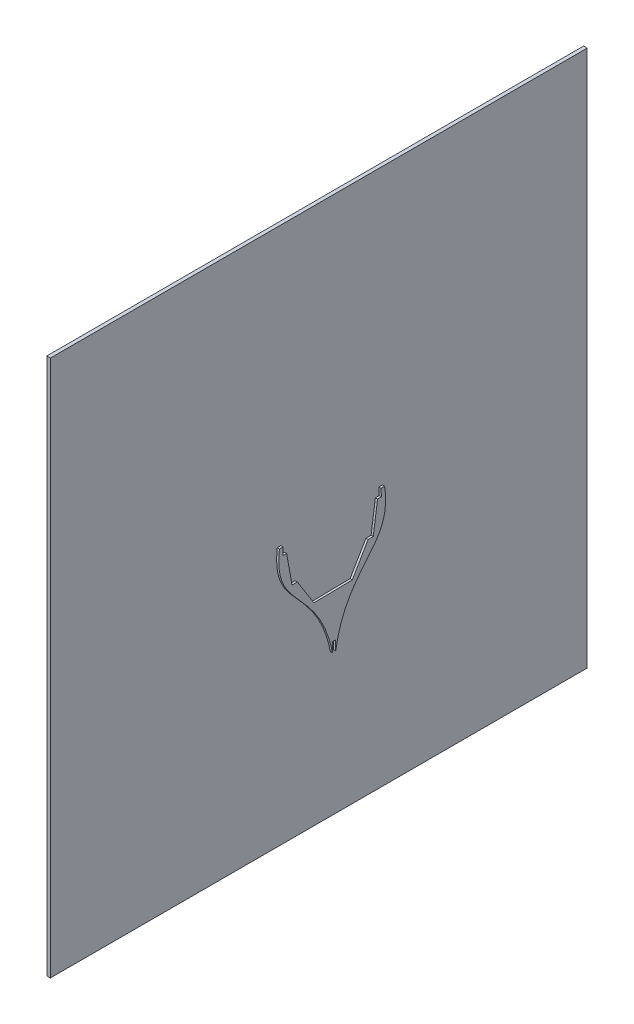
ISO-10303-21;
HEADER;
FILE_DESCRIPTION(('STEP AP214'),'2;1');
FILE_NAME('part.step','',(''),(''),'','','');
FILE_SCHEMA(('AUTOMOTIVE_DESIGN { 1 0 10303 214 1 1 1 1 }'));
ENDSEC;
DATA;
#1=APPLICATION_CONTEXT('core data for automotive mechanical design processes');
#2=APPLICATION_PROTOCOL_DEFINITION('international standard','automotive_design',2000,#1);
#3=PRODUCT_CONTEXT('',#1,'mechanical');
#4=PRODUCT('Part','Part','',(#3));
#5=PRODUCT_RELATED_PRODUCT_CATEGORY('part','',(#4));
#6=PRODUCT_DEFINITION_FORMATION('','',#4);
#7=PRODUCT_DEFINITION_CONTEXT('part definition',#1,'design');
#8=PRODUCT_DEFINITION('design','',#6,#7);
#9=PRODUCT_DEFINITION_SHAPE('','',#8);
#10=(LENGTH_UNIT() NAMED_UNIT(*) SI_UNIT(.MILLI.,.METRE.));
#11=(NAMED_UNIT(*) PLANE_ANGLE_UNIT() SI_UNIT($,.RADIAN.));
#12=(NAMED_UNIT(*) SI_UNIT($,.STERADIAN.) SOLID_ANGLE_UNIT());
#13=UNCERTAINTY_MEASURE_WITH_UNIT(LENGTH_MEASURE(1.E-05),#10,'distance_accuracy_value','');
#14=(GEOMETRIC_REPRESENTATION_CONTEXT(3) GLOBAL_UNCERTAINTY_ASSIGNED_CONTEXT((#13)) GLOBAL_UNIT_ASSIGNED_CONTEXT((#10,
#11,#12)) REPRESENTATION_CONTEXT('',''));
#15=CARTESIAN_POINT('',(0.,0.,0.));
#16=DIRECTION('',(0.,0.,1.));
#17=DIRECTION('',(1.,0.,0.));
#18=AXIS2_PLACEMENT_3D('',#15,#16,#17);
#19=CARTESIAN_POINT('',(6.,355.179062816754,153.44097527104));
#20=CARTESIAN_POINT('',(6.,174.645351927009,174.400842662759));
#21=CARTESIAN_POINT('',(6.,237.675764763136,17.1037062044611));
#22=CARTESIAN_POINT('',(6.,18.0649619587303,4.61229483232223));
#23=CARTESIAN_POINT('',(6.,0.,0.));
#24=B_SPLINE_CURVE_WITH_KNOTS('',4,(#19,#20,#21,#22,#23),.UNSPECIFIED.,.F.,.F.,(5,5),(0.,1.),.UNSPECIFIED.);
#25=DIRECTION('',(-1.,0.,0.));
#26=VECTOR('',#25,1.);
#27=SURFACE_OF_LINEAR_EXTRUSION('',#24,#26);
#28=CARTESIAN_POINT('',(0.,355.179062816754,153.44097527104));
#29=CARTESIAN_POINT('',(0.,174.645351927009,174.400842662759));
#30=CARTESIAN_POINT('',(0.,237.675764763136,17.1037062044611));
#31=CARTESIAN_POINT('',(0.,18.0649619587303,4.61229483232223));
#32=CARTESIAN_POINT('',(0.,0.,0.));
#33=B_SPLINE_CURVE_WITH_KNOTS('',4,(#28,#29,#30,#31,#32),.UNSPECIFIED.,.F.,.F.,(5,5),(0.,1.),.UNSPECIFIED.);
#34=CARTESIAN_POINT('',(0.,355.179062816754,153.44097527104));
#35=VERTEX_POINT('',#34);
#36=CARTESIAN_POINT('',(0.,29.9772074731045,5.04452517346933));
#37=VERTEX_POINT('',#36);
#38=EDGE_CURVE('E192',#35,#37,#33,.T.);
#39=ORIENTED_EDGE('',*,*,#38,.T.);
#40=DIRECTION('',(1.,0.,0.));
#41=VECTOR('',#40,1.);
#42=CARTESIAN_POINT('',(0.,29.9772074731045,5.04452517346933));
#43=LINE('',#42,#41);
#44=CARTESIAN_POINT('',(6.,29.9772074731045,5.04452517346933));
#45=VERTEX_POINT('',#44);
#46=EDGE_CURVE('E198',#37,#45,#43,.T.);
#47=ORIENTED_EDGE('',*,*,#46,.T.);
#48=CARTESIAN_POINT('',(6.,355.179062816754,153.44097527104));
#49=VERTEX_POINT('',#48);
#50=EDGE_CURVE('E232',#49,#45,#24,.T.);
#51=ORIENTED_EDGE('',*,*,#50,.F.);
#52=DIRECTION('',(-1.,0.,0.));
#53=VECTOR('',#52,1.);
#54=CARTESIAN_POINT('',(6.,355.179062816754,153.44097527104));
#55=LINE('',#54,#53);
#56=EDGE_CURVE('E188',#49,#35,#55,.T.);
#57=ORIENTED_EDGE('',*,*,#56,.T.);
#58=EDGE_LOOP('',(#39,#47,#51,#57));
#59=FACE_BOUND('',#58,.T.);
#60=ADVANCED_FACE('F45',(#59),#27,.F.);
#61=CARTESIAN_POINT('',(6.,0.,0.));
#62=CARTESIAN_POINT('',(6.,18.2201613043675,-3.95497613563854));
#63=CARTESIAN_POINT('',(6.,238.139298192958,-8.48413683502499));
#64=CARTESIAN_POINT('',(6.,180.847365103661,-167.960957982064));
#65=CARTESIAN_POINT('',(6.,360.503481806687,-140.476115979804));
#66=B_SPLINE_CURVE_WITH_KNOTS('',4,(#61,#62,#63,#64,#65),.UNSPECIFIED.,.F.,.F.,(5,5),(0.,1.),.UNSPECIFIED.);
#67=DIRECTION('',(-1.,0.,0.));
#68=VECTOR('',#67,1.);
#69=SURFACE_OF_LINEAR_EXTRUSION('',#66,#68);
#70=CARTESIAN_POINT('',(6.,30.1402458684066,-3.95547482653067));
#71=VERTEX_POINT('',#70);
#72=CARTESIAN_POINT('',(6.,360.503481806687,-140.476115979804));
#73=VERTEX_POINT('',#72);
#74=EDGE_CURVE('E128',#71,#73,#66,.T.);
#75=ORIENTED_EDGE('',*,*,#74,.F.);
#76=DIRECTION('',(1.,0.,0.));
#77=VECTOR('',#76,1.);
#78=CARTESIAN_POINT('',(0.,30.1402458684066,-3.95547482653067));
#79=LINE('',#78,#77);
#80=CARTESIAN_POINT('',(0.,30.1402458684066,-3.95547482653067));
#81=VERTEX_POINT('',#80);
#82=EDGE_CURVE('E322',#81,#71,#79,.T.);
#83=ORIENTED_EDGE('',*,*,#82,.F.);
#84=CARTESIAN_POINT('',(0.,0.,0.));
#85=CARTESIAN_POINT('',(0.,18.2201613043675,-3.95497613563854));
#86=CARTESIAN_POINT('',(0.,238.139298192958,-8.48413683502499));
#87=CARTESIAN_POINT('',(0.,180.847365103661,-167.960957982064));
#88=CARTESIAN_POINT('',(0.,360.503481806687,-140.476115979804));
#89=B_SPLINE_CURVE_WITH_KNOTS('',4,(#84,#85,#86,#87,#88),.UNSPECIFIED.,.F.,.F.,(5,5),(0.,1.),.UNSPECIFIED.);
#90=CARTESIAN_POINT('',(0.,360.503481806687,-140.476115979804));
#91=VERTEX_POINT('',#90);
#92=EDGE_CURVE('E197',#81,#91,#89,.T.);
#93=ORIENTED_EDGE('',*,*,#92,.T.);
#94=DIRECTION('',(-1.,0.,0.));
#95=VECTOR('',#94,1.);
#96=CARTESIAN_POINT('',(6.,360.503481806687,-140.476115979804));
#97=LINE('',#96,#95);
#98=EDGE_CURVE('E13',#73,#91,#97,.T.);
#99=ORIENTED_EDGE('',*,*,#98,.F.);
#100=EDGE_LOOP('',(#75,#83,#93,#99));
#101=FACE_BOUND('',#100,.T.);
#102=ADVANCED_FACE('F334',(#101),#69,.F.);
#103=CARTESIAN_POINT('',(6.,360.503481806687,-140.476115979804));
#104=DIRECTION('',(0.,-0.999835956927465,-0.0181124055536444));
#105=DIRECTION('',(0.,0.0181124055536444,-0.999835956927465));
#106=AXIS2_PLACEMENT_3D('',#103,#104,#105);
#107=PLANE('',#106);
#108=DIRECTION('',(0.,-0.0181124055536444,0.999835956927465));
#109=VECTOR('',#108,1.);
#110=CARTESIAN_POINT('',(0.,360.503481806687,-140.476115979804));
#111=LINE('',#110,#109);
#112=CARTESIAN_POINT('',(0.,360.322328034129,-130.476115979804));
#113=VERTEX_POINT('',#112);
#114=EDGE_CURVE('E205',#91,#113,#111,.T.);
#115=ORIENTED_EDGE('',*,*,#114,.T.);
#116=DIRECTION('',(-1.,0.,0.));
#117=VECTOR('',#116,1.);
#118=CARTESIAN_POINT('',(6.,360.322328034129,-130.476115979804));
#119=LINE('',#118,#117);
#120=CARTESIAN_POINT('',(6.,360.322328034129,-130.476115979804));
#121=VERTEX_POINT('',#120);
#122=EDGE_CURVE('E53',#121,#113,#119,.T.);
#123=ORIENTED_EDGE('',*,*,#122,.F.);
#124=DIRECTION('',(0.,-0.0181124055536444,0.999835956927465));
#125=VECTOR('',#124,1.);
#126=CARTESIAN_POINT('',(6.,360.503481806687,-140.476115979804));
#127=LINE('',#126,#125);
#128=EDGE_CURVE('E316',#73,#121,#127,.T.);
#129=ORIENTED_EDGE('',*,*,#128,.F.);
#130=ORIENTED_EDGE('',*,*,#98,.T.);
#131=EDGE_LOOP('',(#115,#123,#129,#130));
#132=FACE_BOUND('',#131,.T.);
#133=ADVANCED_FACE('F337',(#132),#107,.F.);
#134=CARTESIAN_POINT('',(6.,360.322328034129,-130.476115979804));
#135=DIRECTION('',(0.,0.0559282898167763,-0.998434788255182));
#136=DIRECTION('',(0.,0.998434788255182,0.0559282898167763));
#137=AXIS2_PLACEMENT_3D('',#134,#135,#136);
#138=PLANE('',#137);
#139=DIRECTION('',(0.,-0.998434788255182,-0.0559282898167763));
#140=VECTOR('',#139,1.);
#141=CARTESIAN_POINT('',(0.,360.322328034129,-130.476115979804));
#142=LINE('',#141,#140);
#143=CARTESIAN_POINT('',(0.,339.229506667442,-131.657650758366));
#144=VERTEX_POINT('',#143);
#145=EDGE_CURVE('E210',#113,#144,#142,.T.);
#146=ORIENTED_EDGE('',*,*,#145,.T.);
#147=DIRECTION('',(-1.,0.,0.));
#148=VECTOR('',#147,1.);
#149=CARTESIAN_POINT('',(6.,339.229506667442,-131.657650758366));
#150=LINE('',#149,#148);
#151=CARTESIAN_POINT('',(6.,339.229506667442,-131.657650758366));
#152=VERTEX_POINT('',#151);
#153=EDGE_CURVE('E257',#152,#144,#150,.T.);
#154=ORIENTED_EDGE('',*,*,#153,.F.);
#155=DIRECTION('',(0.,-0.998434788255182,-0.0559282898167763));
#156=VECTOR('',#155,1.);
#157=CARTESIAN_POINT('',(6.,360.322328034129,-130.476115979804));
#158=LINE('',#157,#156);
#159=EDGE_CURVE('E266',#121,#152,#158,.T.);
#160=ORIENTED_EDGE('',*,*,#159,.F.);
#161=ORIENTED_EDGE('',*,*,#122,.T.);
#162=EDGE_LOOP('',(#146,#154,#160,#161));
#163=FACE_BOUND('',#162,.T.);
#164=ADVANCED_FACE('F264',(#163),#138,.F.);
#165=CARTESIAN_POINT('',(6.,339.229506667442,-131.657650758366));
#166=DIRECTION('',(0.,-0.999835956927465,-0.018112405553645));
#167=DIRECTION('',(0.,0.018112405553645,-0.999835956927465));
#168=AXIS2_PLACEMENT_3D('',#165,#166,#167);
#169=PLANE('',#168);
#170=DIRECTION('',(0.,-0.018112405553645,0.999835956927465));
#171=VECTOR('',#170,1.);
#172=CARTESIAN_POINT('',(0.,339.229506667442,-131.657650758366));
#173=LINE('',#172,#171);
#174=CARTESIAN_POINT('',(0.,339.034409487756,-120.887950689109));
#175=VERTEX_POINT('',#174);
#176=EDGE_CURVE('E212',#144,#175,#173,.T.);
#177=ORIENTED_EDGE('',*,*,#176,.T.);
#178=DIRECTION('',(-1.,0.,0.));
#179=VECTOR('',#178,1.);
#180=CARTESIAN_POINT('',(6.,339.034409487756,-120.887950689109));
#181=LINE('',#180,#179);
#182=CARTESIAN_POINT('',(6.,339.034409487756,-120.887950689109));
#183=VERTEX_POINT('',#182);
#184=EDGE_CURVE('E254',#183,#175,#181,.T.);
#185=ORIENTED_EDGE('',*,*,#184,.F.);
#186=DIRECTION('',(0.,-0.018112405553645,0.999835956927465));
#187=VECTOR('',#186,1.);
#188=CARTESIAN_POINT('',(6.,339.229506667442,-131.657650758366));
#189=LINE('',#188,#187);
#190=EDGE_CURVE('E287',#152,#183,#189,.T.);
#191=ORIENTED_EDGE('',*,*,#190,.F.);
#192=ORIENTED_EDGE('',*,*,#153,.T.);
#193=EDGE_LOOP('',(#177,#185,#191,#192));
#194=FACE_BOUND('',#193,.T.);
#195=ADVANCED_FACE('F278',(#194),#169,.F.);
#196=CARTESIAN_POINT('',(6.,339.034409487756,-120.887950689109));
#197=DIRECTION('',(0.,-0.140865527772079,-0.990028738514945));
#198=DIRECTION('',(0.,0.990028738514945,-0.140865527772079));
#199=AXIS2_PLACEMENT_3D('',#196,#197,#198);
#200=PLANE('',#199);
#201=DIRECTION('',(0.,-0.990028738514945,0.140865527772079));
#202=VECTOR('',#201,1.);
#203=CARTESIAN_POINT('',(0.,339.034409487756,-120.887950689109));
#204=LINE('',#203,#202);
#205=CARTESIAN_POINT('',(0.,254.593532727848,-108.87334120599));
#206=VERTEX_POINT('',#205);
#207=EDGE_CURVE('E214',#175,#206,#204,.T.);
#208=ORIENTED_EDGE('',*,*,#207,.T.);
#209=DIRECTION('',(-1.,0.,0.));
#210=VECTOR('',#209,1.);
#211=CARTESIAN_POINT('',(6.,254.593532727848,-108.87334120599));
#212=LINE('',#211,#210);
#213=CARTESIAN_POINT('',(6.,254.593532727848,-108.87334120599));
#214=VERTEX_POINT('',#213);
#215=EDGE_CURVE('E251',#214,#206,#212,.T.);
#216=ORIENTED_EDGE('',*,*,#215,.F.);
#217=DIRECTION('',(0.,-0.990028738514945,0.140865527772079));
#218=VECTOR('',#217,1.);
#219=CARTESIAN_POINT('',(6.,339.034409487756,-120.887950689109));
#220=LINE('',#219,#218);
#221=EDGE_CURVE('E284',#183,#214,#220,.T.);
#222=ORIENTED_EDGE('',*,*,#221,.F.);
#223=ORIENTED_EDGE('',*,*,#184,.T.);
#224=EDGE_LOOP('',(#208,#216,#222,#223));
#225=FACE_BOUND('',#224,.T.);
#226=ADVANCED_FACE('F282',(#225),#200,.F.);
#227=CARTESIAN_POINT('',(6.,254.593532727848,-108.87334120599));
#228=DIRECTION('',(0.,-0.999835956927465,-0.0181124055536394));
#229=DIRECTION('',(0.,0.0181124055536394,-0.999835956927465));
#230=AXIS2_PLACEMENT_3D('',#227,#228,#229);
#231=PLANE('',#230);
#232=DIRECTION('',(0.,-0.0181124055536394,0.999835956927465));
#233=VECTOR('',#232,1.);
#234=CARTESIAN_POINT('',(0.,254.593532727848,-108.87334120599));
#235=LINE('',#234,#233);
#236=CARTESIAN_POINT('',(0.,254.330354070036,-94.345426380003));
#237=VERTEX_POINT('',#236);
#238=EDGE_CURVE('E216',#206,#237,#235,.T.);
#239=ORIENTED_EDGE('',*,*,#238,.T.);
#240=DIRECTION('',(-1.,0.,0.));
#241=VECTOR('',#240,1.);
#242=CARTESIAN_POINT('',(6.,254.330354070036,-94.345426380003));
#243=LINE('',#242,#241);
#244=CARTESIAN_POINT('',(6.,254.330354070036,-94.345426380003));
#245=VERTEX_POINT('',#244);
#246=EDGE_CURVE('E248',#245,#237,#243,.T.);
#247=ORIENTED_EDGE('',*,*,#246,.F.);
#248=DIRECTION('',(0.,-0.0181124055536394,0.999835956927465));
#249=VECTOR('',#248,1.);
#250=CARTESIAN_POINT('',(6.,254.593532727848,-108.87334120599));
#251=LINE('',#250,#249);
#252=EDGE_CURVE('E286',#214,#245,#251,.T.);
#253=ORIENTED_EDGE('',*,*,#252,.F.);
#254=ORIENTED_EDGE('',*,*,#215,.T.);
#255=EDGE_LOOP('',(#239,#247,#253,#254));
#256=FACE_BOUND('',#255,.T.);
#257=ADVANCED_FACE('F347',(#256),#231,.F.);
#258=CARTESIAN_POINT('',(6.,254.330354070036,-94.345426380003));
#259=DIRECTION('',(0.,-0.503418538058623,-0.86404269312281));
#260=DIRECTION('',(0.,0.86404269312281,-0.503418538058623));
#261=AXIS2_PLACEMENT_3D('',#258,#259,#260);
#262=PLANE('',#261);
#263=DIRECTION('',(0.,-0.86404269312281,0.503418538058623));
#264=VECTOR('',#263,1.);
#265=CARTESIAN_POINT('',(0.,254.330354070036,-94.345426380003));
#266=LINE('',#265,#264);
#267=CARTESIAN_POINT('',(0.,178.769822999006,-50.3214766498887));
#268=VERTEX_POINT('',#267);
#269=EDGE_CURVE('E218',#237,#268,#266,.T.);
#270=ORIENTED_EDGE('',*,*,#269,.T.);
#271=DIRECTION('',(-1.,0.,0.));
#272=VECTOR('',#271,1.);
#273=CARTESIAN_POINT('',(6.,178.769822999006,-50.3214766498887));
#274=LINE('',#273,#272);
#275=CARTESIAN_POINT('',(6.,178.769822999006,-50.3214766498887));
#276=VERTEX_POINT('',#275);
#277=EDGE_CURVE('E245',#276,#268,#274,.T.);
#278=ORIENTED_EDGE('',*,*,#277,.F.);
#279=DIRECTION('',(0.,-0.86404269312281,0.503418538058623));
#280=VECTOR('',#279,1.);
#281=CARTESIAN_POINT('',(6.,254.330354070036,-94.345426380003));
#282=LINE('',#281,#280);
#283=EDGE_CURVE('E289',#245,#276,#282,.T.);
#284=ORIENTED_EDGE('',*,*,#283,.F.);
#285=ORIENTED_EDGE('',*,*,#246,.T.);
#286=EDGE_LOOP('',(#270,#278,#284,#285));
#287=FACE_BOUND('',#286,.T.);
#288=ADVANCED_FACE('F350',(#287),#262,.F.);
#289=CARTESIAN_POINT('',(6.,178.769822999006,-50.3214766498887));
#290=DIRECTION('',(0.,-0.999835956927465,-0.0181124055536427));
#291=DIRECTION('',(0.,0.0181124055536427,-0.999835956927466));
#292=AXIS2_PLACEMENT_3D('',#289,#290,#291);
#293=PLANE('',#292);
#294=DIRECTION('',(0.,-0.0181124055536427,0.999835956927465));
#295=VECTOR('',#294,1.);
#296=CARTESIAN_POINT('',(0.,178.769822999006,-50.3214766498887));
#297=LINE('',#296,#295);
#298=CARTESIAN_POINT('',(0.,176.829941861815,56.7633005424119));
#299=VERTEX_POINT('',#298);
#300=EDGE_CURVE('E220',#268,#299,#297,.T.);
#301=ORIENTED_EDGE('',*,*,#300,.T.);
#302=DIRECTION('',(-1.,0.,0.));
#303=VECTOR('',#302,1.);
#304=CARTESIAN_POINT('',(6.,176.829941861815,56.7633005424119));
#305=LINE('',#304,#303);
#306=CARTESIAN_POINT('',(6.,176.829941861815,56.7633005424119));
#307=VERTEX_POINT('',#306);
#308=EDGE_CURVE('E242',#307,#299,#305,.T.);
#309=ORIENTED_EDGE('',*,*,#308,.F.);
#310=DIRECTION('',(0.,-0.0181124055536427,0.999835956927465));
#311=VECTOR('',#310,1.);
#312=CARTESIAN_POINT('',(6.,178.769822999006,-50.3214766498887));
#313=LINE('',#312,#311);
#314=EDGE_CURVE('E295',#276,#307,#313,.T.);
#315=ORIENTED_EDGE('',*,*,#314,.F.);
#316=ORIENTED_EDGE('',*,*,#277,.T.);
#317=EDGE_LOOP('',(#301,#309,#315,#316));
#318=FACE_BOUND('',#317,.T.);
#319=ADVANCED_FACE('F354',(#318),#293,.F.);
#320=CARTESIAN_POINT('',(6.,250.746398618855,103.49508229809));
#321=DIRECTION('',(0.,-0.534382884692097,0.845242528833087));
#322=DIRECTION('',(0.,-0.845242528833088,-0.534382884692097));
#323=AXIS2_PLACEMENT_3D('',#320,#321,#322);
#324=PLANE('',#323);
#325=DIRECTION('',(0.,0.845242528833088,0.534382884692097));
#326=VECTOR('',#325,1.);
#327=CARTESIAN_POINT('',(0.,250.746398618855,103.49508229809));
#328=LINE('',#327,#326);
#329=CARTESIAN_POINT('',(0.,250.746398618855,103.49508229809));
#330=VERTEX_POINT('',#329);
#331=EDGE_CURVE('E222',#299,#330,#328,.T.);
#332=ORIENTED_EDGE('',*,*,#331,.T.);
#333=DIRECTION('',(-1.,0.,0.));
#334=VECTOR('',#333,1.);
#335=CARTESIAN_POINT('',(6.,250.746398618855,103.49508229809));
#336=LINE('',#335,#334);
#337=CARTESIAN_POINT('',(6.,250.746398618855,103.49508229809));
#338=VERTEX_POINT('',#337);
#339=EDGE_CURVE('E239',#338,#330,#336,.T.);
#340=ORIENTED_EDGE('',*,*,#339,.F.);
#341=DIRECTION('',(0.,0.845242528833088,0.534382884692097));
#342=VECTOR('',#341,1.);
#343=CARTESIAN_POINT('',(6.,250.746398618855,103.49508229809));
#344=LINE('',#343,#342);
#345=EDGE_CURVE('E297',#307,#338,#344,.T.);
#346=ORIENTED_EDGE('',*,*,#345,.F.);
#347=ORIENTED_EDGE('',*,*,#308,.T.);
#348=EDGE_LOOP('',(#332,#340,#346,#347));
#349=FACE_BOUND('',#348,.T.);
#350=ADVANCED_FACE('F358',(#349),#324,.F.);
#351=CARTESIAN_POINT('',(6.,250.483219961042,118.022997124078));
#352=DIRECTION('',(0.,-0.999835956927465,-0.0181124055536433));
#353=DIRECTION('',(0.,0.0181124055536433,-0.999835956927466));
#354=AXIS2_PLACEMENT_3D('',#351,#352,#353);
#355=PLANE('',#354);
#356=DIRECTION('',(0.,-0.0181124055536433,0.999835956927465));
#357=VECTOR('',#356,1.);
#358=CARTESIAN_POINT('',(0.,250.483219961042,118.022997124078));
#359=LINE('',#358,#357);
#360=CARTESIAN_POINT('',(0.,250.483219961042,118.022997124078));
#361=VERTEX_POINT('',#360);
#362=EDGE_CURVE('E224',#330,#361,#359,.T.);
#363=ORIENTED_EDGE('',*,*,#362,.T.);
#364=DIRECTION('',(-1.,0.,0.));
#365=VECTOR('',#364,1.);
#366=CARTESIAN_POINT('',(6.,250.483219961042,118.022997124078));
#367=LINE('',#366,#365);
#368=CARTESIAN_POINT('',(6.,250.483219961042,118.022997124078));
#369=VERTEX_POINT('',#368);
#370=EDGE_CURVE('E236',#369,#361,#367,.T.);
#371=ORIENTED_EDGE('',*,*,#370,.F.);
#372=DIRECTION('',(0.,-0.0181124055536433,0.999835956927465));
#373=VECTOR('',#372,1.);
#374=CARTESIAN_POINT('',(6.,250.483219961042,118.022997124078));
#375=LINE('',#374,#373);
#376=EDGE_CURVE('E299',#338,#369,#375,.T.);
#377=ORIENTED_EDGE('',*,*,#376,.F.);
#378=ORIENTED_EDGE('',*,*,#339,.T.);
#379=EDGE_LOOP('',(#363,#371,#377,#378));
#380=FACE_BOUND('',#379,.T.);
#381=ADVANCED_FACE('F305',(#380),#355,.F.);
#382=CARTESIAN_POINT('',(6.,334.433537939009,133.088076626426));
#383=DIRECTION('',(0.,-0.176630824165226,0.984277172322264));
#384=DIRECTION('',(0.,-0.984277172322265,-0.176630824165226));
#385=AXIS2_PLACEMENT_3D('',#382,#383,#384);
#386=PLANE('',#385);
#387=DIRECTION('',(0.,0.984277172322265,0.176630824165226));
#388=VECTOR('',#387,1.);
#389=CARTESIAN_POINT('',(0.,334.433537939009,133.088076626426));
#390=LINE('',#389,#388);
#391=CARTESIAN_POINT('',(0.,334.433537939009,133.088076626426));
#392=VERTEX_POINT('',#391);
#393=EDGE_CURVE('E226',#361,#392,#390,.T.);
#394=ORIENTED_EDGE('',*,*,#393,.T.);
#395=DIRECTION('',(-1.,0.,0.));
#396=VECTOR('',#395,1.);
#397=CARTESIAN_POINT('',(6.,334.433537939009,133.088076626426));
#398=LINE('',#397,#396);
#399=CARTESIAN_POINT('',(6.,334.433537939009,133.088076626426));
#400=VERTEX_POINT('',#399);
#401=EDGE_CURVE('E183',#400,#392,#398,.T.);
#402=ORIENTED_EDGE('',*,*,#401,.F.);
#403=DIRECTION('',(0.,0.984277172322265,0.176630824165226));
#404=VECTOR('',#403,1.);
#405=CARTESIAN_POINT('',(6.,334.433537939009,133.088076626426));
#406=LINE('',#405,#404);
#407=EDGE_CURVE('E171',#369,#400,#406,.T.);
#408=ORIENTED_EDGE('',*,*,#407,.F.);
#409=ORIENTED_EDGE('',*,*,#370,.T.);
#410=EDGE_LOOP('',(#394,#402,#408,#409));
#411=FACE_BOUND('',#410,.T.);
#412=ADVANCED_FACE('F309',(#411),#386,.F.);
#413=CARTESIAN_POINT('',(6.,334.238440759322,143.857776695683));
#414=DIRECTION('',(0.,-0.999835956927465,-0.018112405553645));
#415=DIRECTION('',(0.,0.018112405553645,-0.999835956927465));
#416=AXIS2_PLACEMENT_3D('',#413,#414,#415);
#417=PLANE('',#416);
#418=DIRECTION('',(0.,-0.018112405553645,0.999835956927465));
#419=VECTOR('',#418,1.);
#420=CARTESIAN_POINT('',(0.,334.238440759322,143.857776695683));
#421=LINE('',#420,#419);
#422=CARTESIAN_POINT('',(0.,334.238440759322,143.857776695683));
#423=VERTEX_POINT('',#422);
#424=EDGE_CURVE('E180',#392,#423,#421,.T.);
#425=ORIENTED_EDGE('',*,*,#424,.T.);
#426=DIRECTION('',(-1.,0.,0.));
#427=VECTOR('',#426,1.);
#428=CARTESIAN_POINT('',(6.,334.238440759322,143.857776695683));
#429=LINE('',#428,#427);
#430=CARTESIAN_POINT('',(6.,334.238440759322,143.857776695683));
#431=VERTEX_POINT('',#430);
#432=EDGE_CURVE('E177',#431,#423,#429,.T.);
#433=ORIENTED_EDGE('',*,*,#432,.F.);
#434=DIRECTION('',(0.,-0.018112405553645,0.999835956927465));
#435=VECTOR('',#434,1.);
#436=CARTESIAN_POINT('',(6.,334.238440759322,143.857776695683));
#437=LINE('',#436,#435);
#438=EDGE_CURVE('E163',#400,#431,#437,.T.);
#439=ORIENTED_EDGE('',*,*,#438,.F.);
#440=ORIENTED_EDGE('',*,*,#401,.T.);
#441=EDGE_LOOP('',(#425,#433,#439,#440));
#442=FACE_BOUND('',#441,.T.);
#443=ADVANCED_FACE('F178',(#442),#417,.F.);
#444=CARTESIAN_POINT('',(6.,355.360216589312,143.44097527104));
#445=DIRECTION('',(0.,0.0197294157534986,0.999805356133896));
#446=DIRECTION('',(0.,-0.999805356133896,0.0197294157534986));
#447=AXIS2_PLACEMENT_3D('',#444,#445,#446);
#448=PLANE('',#447);
#449=DIRECTION('',(0.,0.999805356133895,-0.0197294157534986));
#450=VECTOR('',#449,1.);
#451=CARTESIAN_POINT('',(0.,355.360216589312,143.44097527104));
#452=LINE('',#451,#450);
#453=CARTESIAN_POINT('',(0.,355.360216589312,143.44097527104));
#454=VERTEX_POINT('',#453);
#455=EDGE_CURVE('E229',#423,#454,#452,.T.);
#456=ORIENTED_EDGE('',*,*,#455,.T.);
#457=DIRECTION('',(-1.,0.,0.));
#458=VECTOR('',#457,1.);
#459=CARTESIAN_POINT('',(6.,355.360216589312,143.44097527104));
#460=LINE('',#459,#458);
#461=CARTESIAN_POINT('',(6.,355.360216589312,143.44097527104));
#462=VERTEX_POINT('',#461);
#463=EDGE_CURVE('E184',#462,#454,#460,.T.);
#464=ORIENTED_EDGE('',*,*,#463,.F.);
#465=DIRECTION('',(0.,0.999805356133895,-0.0197294157534986));
#466=VECTOR('',#465,1.);
#467=CARTESIAN_POINT('',(6.,355.360216589312,143.44097527104));
#468=LINE('',#467,#466);
#469=EDGE_CURVE('E168',#431,#462,#468,.T.);
#470=ORIENTED_EDGE('',*,*,#469,.F.);
#471=ORIENTED_EDGE('',*,*,#432,.T.);
#472=EDGE_LOOP('',(#456,#464,#470,#471));
#473=FACE_BOUND('',#472,.T.);
#474=ADVANCED_FACE('F186',(#473),#448,.F.);
#475=CARTESIAN_POINT('',(6.,355.179062816754,153.44097527104));
#476=DIRECTION('',(0.,-0.999835956927465,-0.0181124055536504));
#477=DIRECTION('',(0.,0.0181124055536504,-0.999835956927465));
#478=AXIS2_PLACEMENT_3D('',#475,#476,#477);
#479=PLANE('',#478);
#480=DIRECTION('',(0.,-0.0181124055536504,0.999835956927465));
#481=VECTOR('',#480,1.);
#482=CARTESIAN_POINT('',(0.,355.179062816754,153.44097527104));
#483=LINE('',#482,#481);
#484=EDGE_CURVE('E120',#454,#35,#483,.T.);
#485=ORIENTED_EDGE('',*,*,#484,.T.);
#486=ORIENTED_EDGE('',*,*,#56,.F.);
#487=DIRECTION('',(0.,-0.0181124055536504,0.999835956927465));
#488=VECTOR('',#487,1.);
#489=CARTESIAN_POINT('',(6.,355.179062816754,153.44097527104));
#490=LINE('',#489,#488);
#491=EDGE_CURVE('E69',#462,#49,#490,.T.);
#492=ORIENTED_EDGE('',*,*,#491,.F.);
#493=ORIENTED_EDGE('',*,*,#463,.T.);
#494=EDGE_LOOP('',(#485,#486,#492,#493));
#495=FACE_BOUND('',#494,.T.);
#496=ADVANCED_FACE('F311',(#495),#479,.F.);
#497=CARTESIAN_POINT('',(6.,159.504681683658,60.7572351548833));
#498=DIRECTION('',(1.,0.,0.));
#499=DIRECTION('',(0.,0.,-1.));
#500=AXIS2_PLACEMENT_3D('',#497,#498,#499);
#501=PLANE('',#500);
#502=DIRECTION('',(0.,-0.999835956927465,-0.018112405553643));
#503=VECTOR('',#502,1.);
#504=CARTESIAN_POINT('',(6.,29.9772074731045,5.04452517346933));
#505=LINE('',#504,#503);
#506=CARTESIAN_POINT('',(6.,56.9772074731045,5.53364035937561));
#507=VERTEX_POINT('',#506);
#508=EDGE_CURVE('E510',#507,#45,#505,.T.);
#509=ORIENTED_EDGE('',*,*,#508,.F.);
#510=DIRECTION('',(0.,-0.0181124055536438,0.999835956927465));
#511=VECTOR('',#510,1.);
#512=CARTESIAN_POINT('',(6.,56.9772074731045,5.53364035937561));
#513=LINE('',#512,#511);
#514=CARTESIAN_POINT('',(6.,57.1402458684066,-3.4663596406244));
#515=VERTEX_POINT('',#514);
#516=EDGE_CURVE('E519',#515,#507,#513,.T.);
#517=ORIENTED_EDGE('',*,*,#516,.F.);
#518=DIRECTION('',(0.,0.999835956927465,0.0181124055536428));
#519=VECTOR('',#518,1.);
#520=CARTESIAN_POINT('',(6.,57.1402458684066,-3.4663596406244));
#521=LINE('',#520,#519);
#522=EDGE_CURVE('E523',#71,#515,#521,.T.);
#523=ORIENTED_EDGE('',*,*,#522,.F.);
#524=ORIENTED_EDGE('',*,*,#74,.T.);
#525=ORIENTED_EDGE('',*,*,#128,.T.);
#526=ORIENTED_EDGE('',*,*,#159,.T.);
#527=ORIENTED_EDGE('',*,*,#190,.T.);
#528=ORIENTED_EDGE('',*,*,#221,.T.);
#529=ORIENTED_EDGE('',*,*,#252,.T.);
#530=ORIENTED_EDGE('',*,*,#283,.T.);
#531=ORIENTED_EDGE('',*,*,#314,.T.);
#532=ORIENTED_EDGE('',*,*,#345,.T.);
#533=ORIENTED_EDGE('',*,*,#376,.T.);
#534=ORIENTED_EDGE('',*,*,#407,.T.);
#535=ORIENTED_EDGE('',*,*,#438,.T.);
#536=ORIENTED_EDGE('',*,*,#469,.T.);
#537=ORIENTED_EDGE('',*,*,#491,.T.);
#538=ORIENTED_EDGE('',*,*,#50,.T.);
#539=EDGE_LOOP('',(#509,#517,#523,#524,#525,#526,#527,#528,#529,#530,#531,#532,#533,#534,#535,
#536,#537,#538));
#540=FACE_BOUND('',#539,.T.);
#541=ADVANCED_FACE('F166',(#540),#501,.T.);
#542=CARTESIAN_POINT('',(0.,159.504681683658,60.7572351548833));
#543=DIRECTION('',(1.,0.,0.));
#544=DIRECTION('',(0.,0.,-1.));
#545=AXIS2_PLACEMENT_3D('',#542,#543,#544);
#546=PLANE('',#545);
#547=DIRECTION('',(0.,-0.0181124055536438,0.999835956927465));
#548=VECTOR('',#547,1.);
#549=CARTESIAN_POINT('',(0.,56.9772074731045,5.53364035937561));
#550=LINE('',#549,#548);
#551=CARTESIAN_POINT('',(0.,57.1402458684066,-3.46635964062438));
#552=VERTEX_POINT('',#551);
#553=CARTESIAN_POINT('',(0.,56.9772074731045,5.53364035937561));
#554=VERTEX_POINT('',#553);
#555=EDGE_CURVE('E60',#552,#554,#550,.T.);
#556=ORIENTED_EDGE('',*,*,#555,.T.);
#557=DIRECTION('',(0.,-0.999835956927465,-0.018112405553643));
#558=VECTOR('',#557,1.);
#559=CARTESIAN_POINT('',(0.,29.9772074731045,5.04452517346933));
#560=LINE('',#559,#558);
#561=EDGE_CURVE('E532',#554,#37,#560,.T.);
#562=ORIENTED_EDGE('',*,*,#561,.T.);
#563=ORIENTED_EDGE('',*,*,#38,.F.);
#564=ORIENTED_EDGE('',*,*,#484,.F.);
#565=ORIENTED_EDGE('',*,*,#455,.F.);
#566=ORIENTED_EDGE('',*,*,#424,.F.);
#567=ORIENTED_EDGE('',*,*,#393,.F.);
#568=ORIENTED_EDGE('',*,*,#362,.F.);
#569=ORIENTED_EDGE('',*,*,#331,.F.);
#570=ORIENTED_EDGE('',*,*,#300,.F.);
#571=ORIENTED_EDGE('',*,*,#269,.F.);
#572=ORIENTED_EDGE('',*,*,#238,.F.);
#573=ORIENTED_EDGE('',*,*,#207,.F.);
#574=ORIENTED_EDGE('',*,*,#176,.F.);
#575=ORIENTED_EDGE('',*,*,#145,.F.);
#576=ORIENTED_EDGE('',*,*,#114,.F.);
#577=ORIENTED_EDGE('',*,*,#92,.F.);
#578=DIRECTION('',(0.,0.999835956927465,0.0181124055536428));
#579=VECTOR('',#578,1.);
#580=CARTESIAN_POINT('',(0.,57.1402458684066,-3.4663596406244));
#581=LINE('',#580,#579);
#582=EDGE_CURVE('E518',#81,#552,#581,.T.);
#583=ORIENTED_EDGE('',*,*,#582,.T.);
#584=EDGE_LOOP('',(#556,#562,#563,#564,#565,#566,#567,#568,#569,#570,#571,#572,#573,#574,#575,
#576,#577,#583));
#585=FACE_BOUND('',#584,.T.);
#586=ADVANCED_FACE('F272',(#585),#546,.F.);
#587=CARTESIAN_POINT('',(0.,29.9772074731045,5.04452517346933));
#588=DIRECTION('',(0.,-0.0181124055536429,0.999835956927465));
#589=DIRECTION('',(0.,-0.999835956927466,-0.018112405553643));
#590=AXIS2_PLACEMENT_3D('',#587,#588,#589);
#591=PLANE('',#590);
#592=ORIENTED_EDGE('',*,*,#508,.T.);
#593=ORIENTED_EDGE('',*,*,#46,.F.);
#594=ORIENTED_EDGE('',*,*,#561,.F.);
#595=DIRECTION('',(1.,0.,0.));
#596=VECTOR('',#595,1.);
#597=CARTESIAN_POINT('',(0.,56.9772074731045,5.53364035937561));
#598=LINE('',#597,#596);
#599=EDGE_CURVE('E514',#554,#507,#598,.T.);
#600=ORIENTED_EDGE('',*,*,#599,.T.);
#601=EDGE_LOOP('',(#592,#593,#594,#600));
#602=FACE_BOUND('',#601,.T.);
#603=ADVANCED_FACE('F375',(#602),#591,.F.);
#604=CARTESIAN_POINT('',(0.,56.9772074731045,5.53364035937561));
#605=DIRECTION('',(0.,0.999835956927465,0.0181124055536438));
#606=DIRECTION('',(0.,-0.0181124055536438,0.999835956927466));
#607=AXIS2_PLACEMENT_3D('',#604,#605,#606);
#608=PLANE('',#607);
#609=ORIENTED_EDGE('',*,*,#516,.T.);
#610=ORIENTED_EDGE('',*,*,#599,.F.);
#611=ORIENTED_EDGE('',*,*,#555,.F.);
#612=DIRECTION('',(1.,0.,0.));
#613=VECTOR('',#612,1.);
#614=CARTESIAN_POINT('',(0.,57.1402458684066,-3.4663596406244));
#615=LINE('',#614,#613);
#616=EDGE_CURVE('E528',#552,#515,#615,.T.);
#617=ORIENTED_EDGE('',*,*,#616,.T.);
#618=EDGE_LOOP('',(#609,#610,#611,#617));
#619=FACE_BOUND('',#618,.T.);
#620=ADVANCED_FACE('F381',(#619),#608,.F.);
#621=CARTESIAN_POINT('',(0.,57.1402458684066,-3.4663596406244));
#622=DIRECTION('',(0.,0.0181124055536428,-0.999835956927465));
#623=DIRECTION('',(0.,0.999835956927466,0.0181124055536428));
#624=AXIS2_PLACEMENT_3D('',#621,#622,#623);
#625=PLANE('',#624);
#626=ORIENTED_EDGE('',*,*,#522,.T.);
#627=ORIENTED_EDGE('',*,*,#616,.F.);
#628=ORIENTED_EDGE('',*,*,#582,.F.);
#629=ORIENTED_EDGE('',*,*,#82,.T.);
#630=EDGE_LOOP('',(#626,#627,#628,#629));
#631=FACE_BOUND('',#630,.T.);
#632=ADVANCED_FACE('F378',(#631),#625,.F.);
#633=CLOSED_SHELL('',(#60,#102,#133,#164,#195,#226,#257,#288,#319,#350,#381,#412,#443,#474,#496,
#541,#586,#603,#620,#632));
#634=MANIFOLD_SOLID_BREP('B2',#633);
#635=CARTESIAN_POINT('',(-10.,0.,0.));
#636=DIRECTION('',(-1.,0.,0.));
#637=DIRECTION('',(0.,0.,1.));
#638=AXIS2_PLACEMENT_3D('',#635,#636,#637);
#639=PLANE('',#638);
#640=DIRECTION('',(0.,0.,-1.));
#641=VECTOR('',#640,1.);
#642=CARTESIAN_POINT('',(-10.,-378.710653275796,777.274991403029));
#643=LINE('',#642,#641);
#644=CARTESIAN_POINT('',(-10.,-378.710653275796,777.274991403029));
#645=VERTEX_POINT('',#644);
#646=CARTESIAN_POINT('',(-10.,-378.710653275796,-722.725008596971));
#647=VERTEX_POINT('',#646);
#648=EDGE_CURVE('E563',#645,#647,#643,.T.);
#649=ORIENTED_EDGE('',*,*,#648,.T.);
#650=DIRECTION('',(0.,-1.,0.));
#651=VECTOR('',#650,1.);
#652=CARTESIAN_POINT('',(-10.,1121.2893467242,-722.725008596971));
#653=LINE('',#652,#651);
#654=CARTESIAN_POINT('',(-10.,1121.2893467242,-722.725008596971));
#655=VERTEX_POINT('',#654);
#656=EDGE_CURVE('E597',#655,#647,#653,.T.);
#657=ORIENTED_EDGE('',*,*,#656,.F.);
#658=DIRECTION('',(0.,0.,-1.));
#659=VECTOR('',#658,1.);
#660=CARTESIAN_POINT('',(-10.,1121.2893467242,777.274991403029));
#661=LINE('',#660,#659);
#662=CARTESIAN_POINT('',(-10.,1121.2893467242,777.274991403029));
#663=VERTEX_POINT('',#662);
#664=EDGE_CURVE('E594',#663,#655,#661,.T.);
#665=ORIENTED_EDGE('',*,*,#664,.F.);
#666=DIRECTION('',(0.,-1.,0.));
#667=VECTOR('',#666,1.);
#668=CARTESIAN_POINT('',(-10.,1121.2893467242,777.274991403029));
#669=LINE('',#668,#667);
#670=EDGE_CURVE('E591',#663,#645,#669,.T.);
#671=ORIENTED_EDGE('',*,*,#670,.T.);
#672=EDGE_LOOP('',(#649,#657,#665,#671));
#673=FACE_BOUND('',#672,.T.);
#674=ADVANCED_FACE('F554',(#673),#639,.F.);
#675=CARTESIAN_POINT('',(-20.,0.,0.));
#676=DIRECTION('',(-1.,0.,0.));
#677=DIRECTION('',(0.,0.,1.));
#678=AXIS2_PLACEMENT_3D('',#675,#676,#677);
#679=PLANE('',#678);
#680=DIRECTION('',(0.,0.,-1.));
#681=VECTOR('',#680,1.);
#682=CARTESIAN_POINT('',(-20.,-378.710653275796,777.274991403029));
#683=LINE('',#682,#681);
#684=CARTESIAN_POINT('',(-20.,-378.710653275796,777.274991403029));
#685=VERTEX_POINT('',#684);
#686=CARTESIAN_POINT('',(-20.,-378.710653275796,-722.725008596971));
#687=VERTEX_POINT('',#686);
#688=EDGE_CURVE('E43',#685,#687,#683,.T.);
#689=ORIENTED_EDGE('',*,*,#688,.F.);
#690=DIRECTION('',(0.,-1.,0.));
#691=VECTOR('',#690,1.);
#692=CARTESIAN_POINT('',(-20.,1121.2893467242,777.274991403029));
#693=LINE('',#692,#691);
#694=CARTESIAN_POINT('',(-20.,1121.2893467242,777.274991403029));
#695=VERTEX_POINT('',#694);
#696=EDGE_CURVE('E610',#695,#685,#693,.T.);
#697=ORIENTED_EDGE('',*,*,#696,.F.);
#698=DIRECTION('',(0.,0.,-1.));
#699=VECTOR('',#698,1.);
#700=CARTESIAN_POINT('',(-20.,1121.2893467242,777.274991403029));
#701=LINE('',#700,#699);
#702=CARTESIAN_POINT('',(-20.,1121.2893467242,-722.725008596971));
#703=VERTEX_POINT('',#702);
#704=EDGE_CURVE('E601',#695,#703,#701,.T.);
#705=ORIENTED_EDGE('',*,*,#704,.T.);
#706=DIRECTION('',(0.,-1.,0.));
#707=VECTOR('',#706,1.);
#708=CARTESIAN_POINT('',(-20.,1121.2893467242,-722.725008596971));
#709=LINE('',#708,#707);
#710=EDGE_CURVE('E572',#703,#687,#709,.T.);
#711=ORIENTED_EDGE('',*,*,#710,.T.);
#712=EDGE_LOOP('',(#689,#697,#705,#711));
#713=FACE_BOUND('',#712,.T.);
#714=ADVANCED_FACE('F650',(#713),#679,.T.);
#715=CARTESIAN_POINT('',(-20.,1121.2893467242,777.274991403029));
#716=DIRECTION('',(0.,0.,1.));
#717=DIRECTION('',(1.,0.,0.));
#718=AXIS2_PLACEMENT_3D('',#715,#716,#717);
#719=PLANE('',#718);
#720=ORIENTED_EDGE('',*,*,#670,.F.);
#721=DIRECTION('',(1.,0.,0.));
#722=VECTOR('',#721,1.);
#723=CARTESIAN_POINT('',(-20.,1121.2893467242,777.274991403029));
#724=LINE('',#723,#722);
#725=EDGE_CURVE('E606',#695,#663,#724,.T.);
#726=ORIENTED_EDGE('',*,*,#725,.F.);
#727=ORIENTED_EDGE('',*,*,#696,.T.);
#728=DIRECTION('',(1.,0.,0.));
#729=VECTOR('',#728,1.);
#730=CARTESIAN_POINT('',(-20.,-378.710653275796,777.274991403029));
#731=LINE('',#730,#729);
#732=EDGE_CURVE('E602',#685,#645,#731,.T.);
#733=ORIENTED_EDGE('',*,*,#732,.T.);
#734=EDGE_LOOP('',(#720,#726,#727,#733));
#735=FACE_BOUND('',#734,.T.);
#736=ADVANCED_FACE('F611',(#735),#719,.T.);
#737=CARTESIAN_POINT('',(-20.,-378.710653275796,777.274991403029));
#738=DIRECTION('',(0.,-1.,0.));
#739=DIRECTION('',(0.,0.,-1.));
#740=AXIS2_PLACEMENT_3D('',#737,#738,#739);
#741=PLANE('',#740);
#742=ORIENTED_EDGE('',*,*,#648,.F.);
#743=ORIENTED_EDGE('',*,*,#732,.F.);
#744=ORIENTED_EDGE('',*,*,#688,.T.);
#745=DIRECTION('',(1.,0.,0.));
#746=VECTOR('',#745,1.);
#747=CARTESIAN_POINT('',(-20.,-378.710653275796,-722.725008596971));
#748=LINE('',#747,#746);
#749=EDGE_CURVE('E622',#687,#647,#748,.T.);
#750=ORIENTED_EDGE('',*,*,#749,.T.);
#751=EDGE_LOOP('',(#742,#743,#744,#750));
#752=FACE_BOUND('',#751,.T.);
#753=ADVANCED_FACE('F652',(#752),#741,.T.);
#754=CARTESIAN_POINT('',(-20.,1121.2893467242,777.274991403029));
#755=DIRECTION('',(0.,-1.,0.));
#756=DIRECTION('',(0.,0.,-1.));
#757=AXIS2_PLACEMENT_3D('',#754,#755,#756);
#758=PLANE('',#757);
#759=ORIENTED_EDGE('',*,*,#664,.T.);
#760=DIRECTION('',(1.,0.,0.));
#761=VECTOR('',#760,1.);
#762=CARTESIAN_POINT('',(-20.,1121.2893467242,-722.725008596971));
#763=LINE('',#762,#761);
#764=EDGE_CURVE('E626',#703,#655,#763,.T.);
#765=ORIENTED_EDGE('',*,*,#764,.F.);
#766=ORIENTED_EDGE('',*,*,#704,.F.);
#767=ORIENTED_EDGE('',*,*,#725,.T.);
#768=EDGE_LOOP('',(#759,#765,#766,#767));
#769=FACE_BOUND('',#768,.T.);
#770=ADVANCED_FACE('F607',(#769),#758,.F.);
#771=CARTESIAN_POINT('',(-20.,1121.2893467242,-722.725008596971));
#772=DIRECTION('',(0.,0.,1.));
#773=DIRECTION('',(1.,0.,0.));
#774=AXIS2_PLACEMENT_3D('',#771,#772,#773);
#775=PLANE('',#774);
#776=ORIENTED_EDGE('',*,*,#656,.T.);
#777=ORIENTED_EDGE('',*,*,#749,.F.);
#778=ORIENTED_EDGE('',*,*,#710,.F.);
#779=ORIENTED_EDGE('',*,*,#764,.T.);
#780=EDGE_LOOP('',(#776,#777,#778,#779));
#781=FACE_BOUND('',#780,.T.);
#782=ADVANCED_FACE('F637',(#781),#775,.F.);
#783=CLOSED_SHELL('',(#674,#714,#736,#753,#770,#782));
#784=MANIFOLD_SOLID_BREP('B7_NOT_SHOWN',#783);
#785=ADVANCED_BREP_SHAPE_REPRESENTATION('',(#18,#634,#784),#14);
#786=SHAPE_DEFINITION_REPRESENTATION(#9,#785);
ENDSEC;
END-ISO-10303-21;
